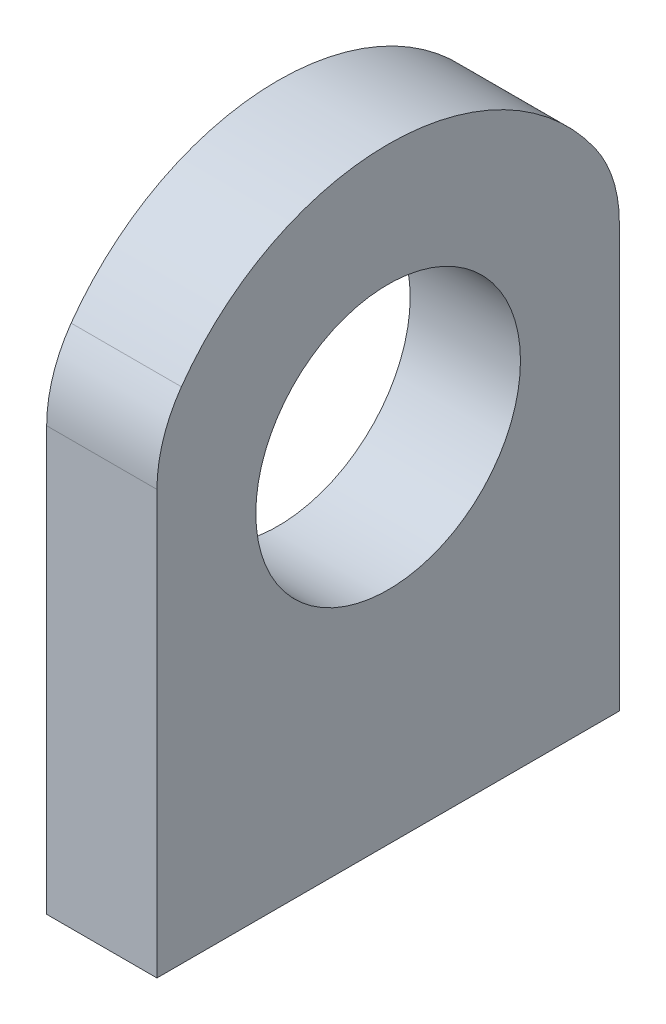
ISO-10303-21;
HEADER;
FILE_DESCRIPTION(('STEP AP214'),'2;1');
FILE_NAME('part.step','',(''),(''),'','','');
FILE_SCHEMA(('AUTOMOTIVE_DESIGN { 1 0 10303 214 1 1 1 1 }'));
ENDSEC;
DATA;
#1=APPLICATION_CONTEXT('core data for automotive mechanical design processes');
#2=APPLICATION_PROTOCOL_DEFINITION('international standard','automotive_design',2000,#1);
#3=PRODUCT_CONTEXT('',#1,'mechanical');
#4=PRODUCT('Part','Part','',(#3));
#5=PRODUCT_RELATED_PRODUCT_CATEGORY('part','',(#4));
#6=PRODUCT_DEFINITION_FORMATION('','',#4);
#7=PRODUCT_DEFINITION_CONTEXT('part definition',#1,'design');
#8=PRODUCT_DEFINITION('design','',#6,#7);
#9=PRODUCT_DEFINITION_SHAPE('','',#8);
#10=(LENGTH_UNIT() NAMED_UNIT(*) SI_UNIT(.MILLI.,.METRE.));
#11=(NAMED_UNIT(*) PLANE_ANGLE_UNIT() SI_UNIT($,.RADIAN.));
#12=(NAMED_UNIT(*) SI_UNIT($,.STERADIAN.) SOLID_ANGLE_UNIT());
#13=UNCERTAINTY_MEASURE_WITH_UNIT(LENGTH_MEASURE(1.E-05),#10,'distance_accuracy_value','');
#14=(GEOMETRIC_REPRESENTATION_CONTEXT(3) GLOBAL_UNCERTAINTY_ASSIGNED_CONTEXT((#13)) GLOBAL_UNIT_ASSIGNED_CONTEXT((#10,
#11,#12)) REPRESENTATION_CONTEXT('',''));
#15=CARTESIAN_POINT('',(0.,0.,0.));
#16=DIRECTION('',(0.,0.,1.));
#17=DIRECTION('',(1.,0.,0.));
#18=AXIS2_PLACEMENT_3D('',#15,#16,#17);
#19=CARTESIAN_POINT('',(-20.,45.,0.));
#20=DIRECTION('',(-1.,0.,0.));
#21=DIRECTION('',(0.,0.,1.));
#22=AXIS2_PLACEMENT_3D('',#19,#20,#21);
#23=PLANE('',#22);
#24=DIRECTION('',(0.,1.,0.));
#25=VECTOR('',#24,1.);
#26=CARTESIAN_POINT('',(-20.,49.7277777777778,10.4832302886062));
#27=LINE('',#26,#25);
#28=CARTESIAN_POINT('',(-20.,29.,10.4832302886062));
#29=VERTEX_POINT('',#28);
#30=CARTESIAN_POINT('',(-20.,48.1860078749626,10.4832302886062));
#31=VERTEX_POINT('',#30);
#32=EDGE_CURVE('E114',#29,#31,#27,.T.);
#33=ORIENTED_EDGE('',*,*,#32,.T.);
#34=CARTESIAN_POINT('',(-20.,48.1860078749626,4.4832302886062));
#35=DIRECTION('',(-1.,0.,0.));
#36=DIRECTION('',(0.,0.,1.));
#37=AXIS2_PLACEMENT_3D('',#34,#35,#36);
#38=CIRCLE('',#37,6.);
#39=CARTESIAN_POINT('',(-20.,51.6616528294674,9.37402696708569));
#40=VERTEX_POINT('',#39);
#41=EDGE_CURVE('E47',#31,#40,#38,.T.);
#42=ORIENTED_EDGE('',*,*,#41,.T.);
#43=CARTESIAN_POINT('',(-20.,45.,0.));
#44=DIRECTION('',(-1.,0.,0.));
#45=DIRECTION('',(0.,0.,1.));
#46=AXIS2_PLACEMENT_3D('',#43,#44,#45);
#47=CIRCLE('',#46,11.5);
#48=CARTESIAN_POINT('',(-20.,51.6616528294674,-9.37402696708569));
#49=VERTEX_POINT('',#48);
#50=EDGE_CURVE('E100',#40,#49,#47,.T.);
#51=ORIENTED_EDGE('',*,*,#50,.T.);
#52=CARTESIAN_POINT('',(-20.,48.1860078749626,-4.4832302886062));
#53=DIRECTION('',(-1.,0.,0.));
#54=DIRECTION('',(0.,0.,1.));
#55=AXIS2_PLACEMENT_3D('',#52,#53,#54);
#56=CIRCLE('',#55,6.);
#57=CARTESIAN_POINT('',(-20.,48.1860078749626,-10.4832302886062));
#58=VERTEX_POINT('',#57);
#59=EDGE_CURVE('E54',#49,#58,#56,.T.);
#60=ORIENTED_EDGE('',*,*,#59,.T.);
#61=DIRECTION('',(0.,-1.,0.));
#62=VECTOR('',#61,1.);
#63=CARTESIAN_POINT('',(-20.,49.7277777777778,-10.4832302886062));
#64=LINE('',#63,#62);
#65=CARTESIAN_POINT('',(-20.,29.,-10.4832302886062));
#66=VERTEX_POINT('',#65);
#67=EDGE_CURVE('E92',#58,#66,#64,.T.);
#68=ORIENTED_EDGE('',*,*,#67,.T.);
#69=DIRECTION('',(0.,0.,1.));
#70=VECTOR('',#69,1.);
#71=CARTESIAN_POINT('',(-20.,29.,-10.4832302886062));
#72=LINE('',#71,#70);
#73=EDGE_CURVE('E96',#66,#29,#72,.T.);
#74=ORIENTED_EDGE('',*,*,#73,.T.);
#75=EDGE_LOOP('',(#33,#42,#51,#60,#68,#74));
#76=FACE_BOUND('',#75,.T.);
#77=CARTESIAN_POINT('',(-20.,45.,0.));
#78=DIRECTION('',(-1.,0.,0.));
#79=DIRECTION('',(0.,0.,1.));
#80=AXIS2_PLACEMENT_3D('',#77,#78,#79);
#81=CIRCLE('',#80,6.);
#82=CARTESIAN_POINT('',(-20.,45.,6.));
#83=VERTEX_POINT('',#82);
#84=EDGE_CURVE('E122',#83,#83,#81,.T.);
#85=ORIENTED_EDGE('',*,*,#84,.F.);
#86=EDGE_LOOP('',(#85));
#87=FACE_BOUND('',#86,.T.);
#88=ADVANCED_FACE('F39',(#76,#87),#23,.T.);
#89=CARTESIAN_POINT('',(-15.,45.,0.));
#90=DIRECTION('',(-1.,0.,0.));
#91=DIRECTION('',(0.,0.,1.));
#92=AXIS2_PLACEMENT_3D('',#89,#90,#91);
#93=PLANE('',#92);
#94=CARTESIAN_POINT('',(-15.,45.,0.));
#95=DIRECTION('',(-1.,0.,0.));
#96=DIRECTION('',(0.,0.,1.));
#97=AXIS2_PLACEMENT_3D('',#94,#95,#96);
#98=CIRCLE('',#97,11.5);
#99=CARTESIAN_POINT('',(-15.,51.6616528294674,9.37402696708569));
#100=VERTEX_POINT('',#99);
#101=CARTESIAN_POINT('',(-15.,51.6616528294674,-9.37402696708569));
#102=VERTEX_POINT('',#101);
#103=EDGE_CURVE('E119',#100,#102,#98,.T.);
#104=ORIENTED_EDGE('',*,*,#103,.F.);
#105=CARTESIAN_POINT('',(-15.,48.1860078749626,4.4832302886062));
#106=DIRECTION('',(-1.,0.,0.));
#107=DIRECTION('',(0.,0.,1.));
#108=AXIS2_PLACEMENT_3D('',#105,#106,#107);
#109=CIRCLE('',#108,6.);
#110=CARTESIAN_POINT('',(-15.,48.1860078749626,10.4832302886062));
#111=VERTEX_POINT('',#110);
#112=EDGE_CURVE('E135',#100,#111,#109,.F.);
#113=ORIENTED_EDGE('',*,*,#112,.T.);
#114=DIRECTION('',(0.,1.,0.));
#115=VECTOR('',#114,1.);
#116=CARTESIAN_POINT('',(-15.,49.7277777777778,10.4832302886062));
#117=LINE('',#116,#115);
#118=CARTESIAN_POINT('',(-15.,29.,10.4832302886062));
#119=VERTEX_POINT('',#118);
#120=EDGE_CURVE('E126',#119,#111,#117,.T.);
#121=ORIENTED_EDGE('',*,*,#120,.F.);
#122=DIRECTION('',(0.,0.,1.));
#123=VECTOR('',#122,1.);
#124=CARTESIAN_POINT('',(-15.,29.,-10.4832302886062));
#125=LINE('',#124,#123);
#126=CARTESIAN_POINT('',(-15.,29.,-10.4832302886062));
#127=VERTEX_POINT('',#126);
#128=EDGE_CURVE('E124',#127,#119,#125,.T.);
#129=ORIENTED_EDGE('',*,*,#128,.F.);
#130=DIRECTION('',(0.,-1.,0.));
#131=VECTOR('',#130,1.);
#132=CARTESIAN_POINT('',(-15.,49.7277777777778,-10.4832302886062));
#133=LINE('',#132,#131);
#134=CARTESIAN_POINT('',(-15.,48.1860078749626,-10.4832302886062));
#135=VERTEX_POINT('',#134);
#136=EDGE_CURVE('E106',#135,#127,#133,.T.);
#137=ORIENTED_EDGE('',*,*,#136,.F.);
#138=CARTESIAN_POINT('',(-15.,48.1860078749626,-4.4832302886062));
#139=DIRECTION('',(-1.,0.,0.));
#140=DIRECTION('',(0.,0.,1.));
#141=AXIS2_PLACEMENT_3D('',#138,#139,#140);
#142=CIRCLE('',#141,6.);
#143=EDGE_CURVE('E133',#135,#102,#142,.F.);
#144=ORIENTED_EDGE('',*,*,#143,.T.);
#145=EDGE_LOOP('',(#104,#113,#121,#129,#137,#144));
#146=FACE_BOUND('',#145,.T.);
#147=CARTESIAN_POINT('',(-15.,45.,0.));
#148=DIRECTION('',(-1.,0.,0.));
#149=DIRECTION('',(0.,0.,1.));
#150=AXIS2_PLACEMENT_3D('',#147,#148,#149);
#151=CIRCLE('',#150,6.);
#152=CARTESIAN_POINT('',(-15.,45.,6.));
#153=VERTEX_POINT('',#152);
#154=EDGE_CURVE('E230',#153,#153,#151,.T.);
#155=ORIENTED_EDGE('',*,*,#154,.T.);
#156=EDGE_LOOP('',(#155));
#157=FACE_BOUND('',#156,.T.);
#158=ADVANCED_FACE('F149',(#146,#157),#93,.F.);
#159=CARTESIAN_POINT('',(-20.,45.,0.));
#160=DIRECTION('',(1.,0.,0.));
#161=DIRECTION('',(0.,0.,-1.));
#162=AXIS2_PLACEMENT_3D('',#159,#160,#161);
#163=CYLINDRICAL_SURFACE('',#162,11.5);
#164=ORIENTED_EDGE('',*,*,#50,.F.);
#165=DIRECTION('',(1.,0.,0.));
#166=VECTOR('',#165,1.);
#167=CARTESIAN_POINT('',(-20.,51.6616528294674,9.37402696708569));
#168=LINE('',#167,#166);
#169=EDGE_CURVE('E130',#40,#100,#168,.T.);
#170=ORIENTED_EDGE('',*,*,#169,.T.);
#171=ORIENTED_EDGE('',*,*,#103,.T.);
#172=DIRECTION('',(1.,0.,0.));
#173=VECTOR('',#172,1.);
#174=CARTESIAN_POINT('',(-20.,51.6616528294674,-9.37402696708569));
#175=LINE('',#174,#173);
#176=EDGE_CURVE('E109',#102,#49,#175,.F.);
#177=ORIENTED_EDGE('',*,*,#176,.T.);
#178=EDGE_LOOP('',(#164,#170,#171,#177));
#179=FACE_BOUND('',#178,.T.);
#180=ADVANCED_FACE('F143',(#179),#163,.T.);
#181=CARTESIAN_POINT('',(-20.,49.7277777777778,-10.4832302886062));
#182=DIRECTION('',(0.,0.,1.));
#183=DIRECTION('',(1.,0.,0.));
#184=AXIS2_PLACEMENT_3D('',#181,#182,#183);
#185=PLANE('',#184);
#186=ORIENTED_EDGE('',*,*,#67,.F.);
#187=DIRECTION('',(1.,0.,0.));
#188=VECTOR('',#187,1.);
#189=CARTESIAN_POINT('',(-20.,48.1860078749626,-10.4832302886062));
#190=LINE('',#189,#188);
#191=EDGE_CURVE('E11',#58,#135,#190,.T.);
#192=ORIENTED_EDGE('',*,*,#191,.T.);
#193=ORIENTED_EDGE('',*,*,#136,.T.);
#194=DIRECTION('',(1.,0.,0.));
#195=VECTOR('',#194,1.);
#196=CARTESIAN_POINT('',(-20.,29.,-10.4832302886062));
#197=LINE('',#196,#195);
#198=EDGE_CURVE('E103',#66,#127,#197,.T.);
#199=ORIENTED_EDGE('',*,*,#198,.F.);
#200=EDGE_LOOP('',(#186,#192,#193,#199));
#201=FACE_BOUND('',#200,.T.);
#202=ADVANCED_FACE('F104',(#201),#185,.F.);
#203=CARTESIAN_POINT('',(-20.,29.,-10.4832302886062));
#204=DIRECTION('',(0.,1.,0.));
#205=DIRECTION('',(0.,0.,1.));
#206=AXIS2_PLACEMENT_3D('',#203,#204,#205);
#207=PLANE('',#206);
#208=ORIENTED_EDGE('',*,*,#128,.T.);
#209=DIRECTION('',(1.,0.,0.));
#210=VECTOR('',#209,1.);
#211=CARTESIAN_POINT('',(-20.,29.,10.4832302886062));
#212=LINE('',#211,#210);
#213=EDGE_CURVE('E110',#29,#119,#212,.T.);
#214=ORIENTED_EDGE('',*,*,#213,.F.);
#215=ORIENTED_EDGE('',*,*,#73,.F.);
#216=ORIENTED_EDGE('',*,*,#198,.T.);
#217=EDGE_LOOP('',(#208,#214,#215,#216));
#218=FACE_BOUND('',#217,.T.);
#219=ADVANCED_FACE('F112',(#218),#207,.F.);
#220=CARTESIAN_POINT('',(-20.,49.7277777777778,10.4832302886062));
#221=DIRECTION('',(0.,0.,-1.));
#222=DIRECTION('',(0.,1.,0.));
#223=AXIS2_PLACEMENT_3D('',#220,#221,#222);
#224=PLANE('',#223);
#225=ORIENTED_EDGE('',*,*,#120,.T.);
#226=DIRECTION('',(1.,0.,0.));
#227=VECTOR('',#226,1.);
#228=CARTESIAN_POINT('',(-20.,48.1860078749626,10.4832302886062));
#229=LINE('',#228,#227);
#230=EDGE_CURVE('E62',#111,#31,#229,.F.);
#231=ORIENTED_EDGE('',*,*,#230,.T.);
#232=ORIENTED_EDGE('',*,*,#32,.F.);
#233=ORIENTED_EDGE('',*,*,#213,.T.);
#234=EDGE_LOOP('',(#225,#231,#232,#233));
#235=FACE_BOUND('',#234,.T.);
#236=ADVANCED_FACE('F151',(#235),#224,.F.);
#237=CARTESIAN_POINT('',(-20.,45.,0.));
#238=DIRECTION('',(1.,0.,0.));
#239=DIRECTION('',(0.,0.,-1.));
#240=AXIS2_PLACEMENT_3D('',#237,#238,#239);
#241=CYLINDRICAL_SURFACE('',#240,6.);
#242=ORIENTED_EDGE('',*,*,#84,.T.);
#243=EDGE_LOOP('',(#242));
#244=FACE_BOUND('',#243,.T.);
#245=ORIENTED_EDGE('',*,*,#154,.F.);
#246=EDGE_LOOP('',(#245));
#247=FACE_BOUND('',#246,.T.);
#248=ADVANCED_FACE('F153',(#244,#247),#241,.F.);
#249=CARTESIAN_POINT('',(-20.,48.1860078749626,4.4832302886062));
#250=DIRECTION('',(1.,0.,0.));
#251=DIRECTION('',(0.,0.,-1.));
#252=AXIS2_PLACEMENT_3D('',#249,#250,#251);
#253=CYLINDRICAL_SURFACE('',#252,6.);
#254=ORIENTED_EDGE('',*,*,#41,.F.);
#255=ORIENTED_EDGE('',*,*,#230,.F.);
#256=ORIENTED_EDGE('',*,*,#112,.F.);
#257=ORIENTED_EDGE('',*,*,#169,.F.);
#258=EDGE_LOOP('',(#254,#255,#256,#257));
#259=FACE_BOUND('',#258,.T.);
#260=ADVANCED_FACE('F146',(#259),#253,.T.);
#261=CARTESIAN_POINT('',(-20.,48.1860078749626,-4.4832302886062));
#262=DIRECTION('',(1.,0.,0.));
#263=DIRECTION('',(0.,0.,-1.));
#264=AXIS2_PLACEMENT_3D('',#261,#262,#263);
#265=CYLINDRICAL_SURFACE('',#264,6.);
#266=ORIENTED_EDGE('',*,*,#59,.F.);
#267=ORIENTED_EDGE('',*,*,#176,.F.);
#268=ORIENTED_EDGE('',*,*,#143,.F.);
#269=ORIENTED_EDGE('',*,*,#191,.F.);
#270=EDGE_LOOP('',(#266,#267,#268,#269));
#271=FACE_BOUND('',#270,.T.);
#272=ADVANCED_FACE('F41',(#271),#265,.T.);
#273=CLOSED_SHELL('',(#88,#158,#180,#202,#219,#236,#248,#260,#272));
#274=MANIFOLD_SOLID_BREP('B2',#273);
#275=ADVANCED_BREP_SHAPE_REPRESENTATION('',(#18,#274),#14);
#276=SHAPE_DEFINITION_REPRESENTATION(#9,#275);
ENDSEC;
END-ISO-10303-21;
